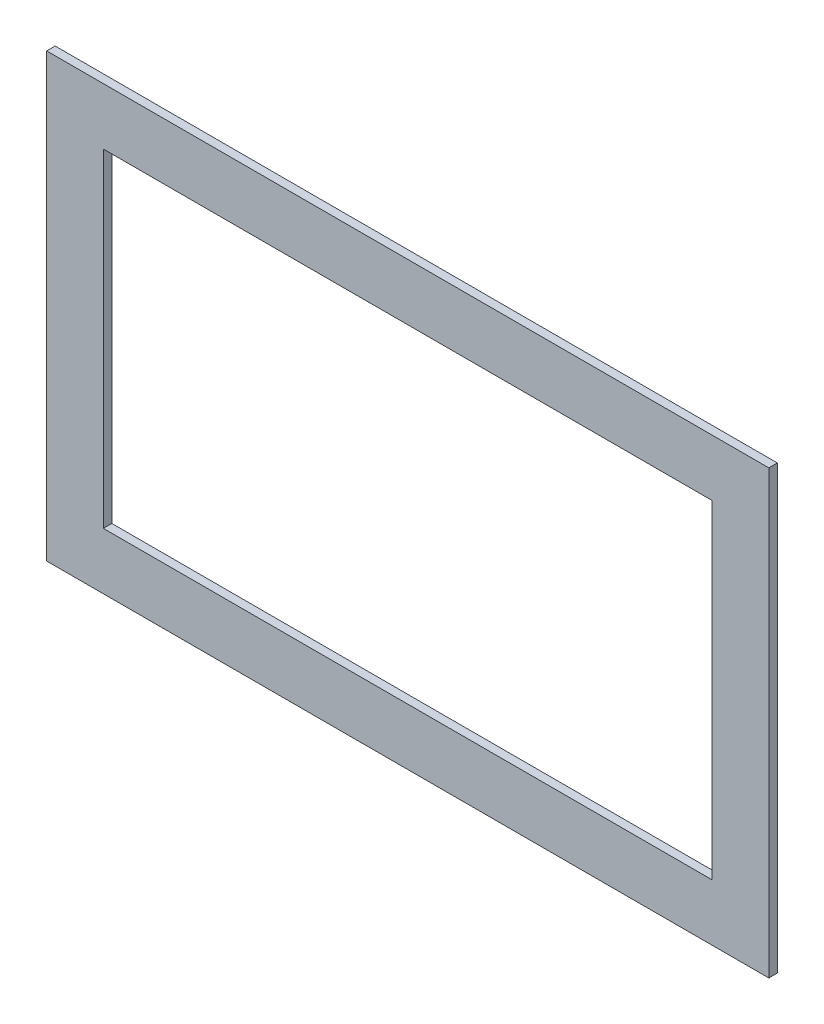
ISO-10303-21;
HEADER;
FILE_DESCRIPTION(('STEP AP214'),'2;1');
FILE_NAME('part.step','',(''),(''),'','','');
FILE_SCHEMA(('AUTOMOTIVE_DESIGN { 1 0 10303 214 1 1 1 1 }'));
ENDSEC;
DATA;
#1=APPLICATION_CONTEXT('core data for automotive mechanical design processes');
#2=APPLICATION_PROTOCOL_DEFINITION('international standard','automotive_design',2000,#1);
#3=PRODUCT_CONTEXT('',#1,'mechanical');
#4=PRODUCT('Part','Part','',(#3));
#5=PRODUCT_RELATED_PRODUCT_CATEGORY('part','',(#4));
#6=PRODUCT_DEFINITION_FORMATION('','',#4);
#7=PRODUCT_DEFINITION_CONTEXT('part definition',#1,'design');
#8=PRODUCT_DEFINITION('design','',#6,#7);
#9=PRODUCT_DEFINITION_SHAPE('','',#8);
#10=(LENGTH_UNIT() NAMED_UNIT(*) SI_UNIT(.MILLI.,.METRE.));
#11=(NAMED_UNIT(*) PLANE_ANGLE_UNIT() SI_UNIT($,.RADIAN.));
#12=(NAMED_UNIT(*) SI_UNIT($,.STERADIAN.) SOLID_ANGLE_UNIT());
#13=UNCERTAINTY_MEASURE_WITH_UNIT(LENGTH_MEASURE(1.E-05),#10,'distance_accuracy_value','');
#14=(GEOMETRIC_REPRESENTATION_CONTEXT(3) GLOBAL_UNCERTAINTY_ASSIGNED_CONTEXT((#13)) GLOBAL_UNIT_ASSIGNED_CONTEXT((#10,
#11,#12)) REPRESENTATION_CONTEXT('',''));
#15=CARTESIAN_POINT('',(0.,0.,0.));
#16=DIRECTION('',(0.,0.,1.));
#17=DIRECTION('',(1.,0.,0.));
#18=AXIS2_PLACEMENT_3D('',#15,#16,#17);
#19=CARTESIAN_POINT('',(0.,0.,21.2898507801741));
#20=DIRECTION('',(0.,0.,-1.));
#21=DIRECTION('',(-1.,0.,0.));
#22=AXIS2_PLACEMENT_3D('',#19,#20,#21);
#23=PLANE('',#22);
#24=DIRECTION('',(0.,-1.,0.));
#25=VECTOR('',#24,1.);
#26=CARTESIAN_POINT('',(9.78246570978144,156.585651873292,21.2898507801741));
#27=LINE('',#26,#25);
#28=CARTESIAN_POINT('',(9.78246570978144,156.585651873292,21.2898507801741));
#29=VERTEX_POINT('',#28);
#30=CARTESIAN_POINT('',(9.78246570978142,0.585651873292431,21.2898507801741));
#31=VERTEX_POINT('',#30);
#32=EDGE_CURVE('E134',#29,#31,#27,.T.);
#33=ORIENTED_EDGE('',*,*,#32,.T.);
#34=DIRECTION('',(-1.,0.,0.));
#35=VECTOR('',#34,1.);
#36=CARTESIAN_POINT('',(9.78246570978142,0.585651873292431,21.2898507801741));
#37=LINE('',#36,#35);
#38=CARTESIAN_POINT('',(-245.217534290219,0.585651873292431,21.2898507801741));
#39=VERTEX_POINT('',#38);
#40=EDGE_CURVE('E137',#31,#39,#37,.T.);
#41=ORIENTED_EDGE('',*,*,#40,.T.);
#42=DIRECTION('',(0.,1.,0.));
#43=VECTOR('',#42,1.);
#44=CARTESIAN_POINT('',(-245.217534290219,156.585651873292,21.2898507801741));
#45=LINE('',#44,#43);
#46=CARTESIAN_POINT('',(-245.217534290219,156.585651873292,21.2898507801741));
#47=VERTEX_POINT('',#46);
#48=EDGE_CURVE('E140',#39,#47,#45,.T.);
#49=ORIENTED_EDGE('',*,*,#48,.T.);
#50=DIRECTION('',(1.,0.,0.));
#51=VECTOR('',#50,1.);
#52=CARTESIAN_POINT('',(9.78246570978144,156.585651873292,21.2898507801741));
#53=LINE('',#52,#51);
#54=EDGE_CURVE('E142',#47,#29,#53,.T.);
#55=ORIENTED_EDGE('',*,*,#54,.T.);
#56=EDGE_LOOP('',(#33,#41,#49,#55));
#57=FACE_BOUND('',#56,.T.);
#58=DIRECTION('',(-1.,0.,0.));
#59=VECTOR('',#58,1.);
#60=CARTESIAN_POINT('',(-10.2175342902186,20.5856518732924,21.2898507801741));
#61=LINE('',#60,#59);
#62=CARTESIAN_POINT('',(-10.2175342902186,20.5856518732924,21.2898507801741));
#63=VERTEX_POINT('',#62);
#64=CARTESIAN_POINT('',(-225.217534290219,20.5856518732924,21.2898507801741));
#65=VERTEX_POINT('',#64);
#66=EDGE_CURVE('E106',#63,#65,#61,.T.);
#67=ORIENTED_EDGE('',*,*,#66,.F.);
#68=DIRECTION('',(0.,-1.,0.));
#69=VECTOR('',#68,1.);
#70=CARTESIAN_POINT('',(-10.2175342902186,136.585651873292,21.2898507801741));
#71=LINE('',#70,#69);
#72=CARTESIAN_POINT('',(-10.2175342902186,136.585651873292,21.2898507801741));
#73=VERTEX_POINT('',#72);
#74=EDGE_CURVE('E98',#73,#63,#71,.T.);
#75=ORIENTED_EDGE('',*,*,#74,.F.);
#76=DIRECTION('',(1.,0.,0.));
#77=VECTOR('',#76,1.);
#78=CARTESIAN_POINT('',(-10.2175342902186,136.585651873292,21.2898507801741));
#79=LINE('',#78,#77);
#80=CARTESIAN_POINT('',(-225.217534290219,136.585651873292,21.2898507801741));
#81=VERTEX_POINT('',#80);
#82=EDGE_CURVE('E120',#81,#73,#79,.T.);
#83=ORIENTED_EDGE('',*,*,#82,.F.);
#84=DIRECTION('',(0.,1.,0.));
#85=VECTOR('',#84,1.);
#86=CARTESIAN_POINT('',(-225.217534290219,136.585651873292,21.2898507801741));
#87=LINE('',#86,#85);
#88=EDGE_CURVE('E118',#65,#81,#87,.T.);
#89=ORIENTED_EDGE('',*,*,#88,.F.);
#90=EDGE_LOOP('',(#67,#75,#83,#89));
#91=FACE_BOUND('',#90,.T.);
#92=ADVANCED_FACE('F33',(#57,#91),#23,.T.);
#93=CARTESIAN_POINT('',(0.,0.,24.2898507801741));
#94=DIRECTION('',(0.,0.,-1.));
#95=DIRECTION('',(-1.,0.,0.));
#96=AXIS2_PLACEMENT_3D('',#93,#94,#95);
#97=PLANE('',#96);
#98=DIRECTION('',(0.,-1.,0.));
#99=VECTOR('',#98,1.);
#100=CARTESIAN_POINT('',(9.78246570978144,156.585651873292,24.2898507801741));
#101=LINE('',#100,#99);
#102=CARTESIAN_POINT('',(9.78246570978144,156.585651873292,24.2898507801741));
#103=VERTEX_POINT('',#102);
#104=CARTESIAN_POINT('',(9.78246570978142,0.585651873292431,24.2898507801741));
#105=VERTEX_POINT('',#104);
#106=EDGE_CURVE('E114',#103,#105,#101,.T.);
#107=ORIENTED_EDGE('',*,*,#106,.F.);
#108=DIRECTION('',(1.,0.,0.));
#109=VECTOR('',#108,1.);
#110=CARTESIAN_POINT('',(9.78246570978144,156.585651873292,24.2898507801741));
#111=LINE('',#110,#109);
#112=CARTESIAN_POINT('',(-245.217534290219,156.585651873292,24.2898507801741));
#113=VERTEX_POINT('',#112);
#114=EDGE_CURVE('E138',#113,#103,#111,.T.);
#115=ORIENTED_EDGE('',*,*,#114,.F.);
#116=DIRECTION('',(0.,1.,0.));
#117=VECTOR('',#116,1.);
#118=CARTESIAN_POINT('',(-245.217534290219,156.585651873292,24.2898507801741));
#119=LINE('',#118,#117);
#120=CARTESIAN_POINT('',(-245.217534290219,0.585651873292431,24.2898507801741));
#121=VERTEX_POINT('',#120);
#122=EDGE_CURVE('E149',#121,#113,#119,.T.);
#123=ORIENTED_EDGE('',*,*,#122,.F.);
#124=DIRECTION('',(-1.,0.,0.));
#125=VECTOR('',#124,1.);
#126=CARTESIAN_POINT('',(9.78246570978142,0.585651873292431,24.2898507801741));
#127=LINE('',#126,#125);
#128=EDGE_CURVE('E147',#105,#121,#127,.T.);
#129=ORIENTED_EDGE('',*,*,#128,.F.);
#130=EDGE_LOOP('',(#107,#115,#123,#129));
#131=FACE_BOUND('',#130,.T.);
#132=DIRECTION('',(0.,-1.,0.));
#133=VECTOR('',#132,1.);
#134=CARTESIAN_POINT('',(-10.2175342902186,136.585651873292,24.2898507801741));
#135=LINE('',#134,#133);
#136=CARTESIAN_POINT('',(-10.2175342902186,136.585651873292,24.2898507801741));
#137=VERTEX_POINT('',#136);
#138=CARTESIAN_POINT('',(-10.2175342902186,20.5856518732924,24.2898507801741));
#139=VERTEX_POINT('',#138);
#140=EDGE_CURVE('E56',#137,#139,#135,.T.);
#141=ORIENTED_EDGE('',*,*,#140,.T.);
#142=DIRECTION('',(-1.,0.,0.));
#143=VECTOR('',#142,1.);
#144=CARTESIAN_POINT('',(-10.2175342902186,20.5856518732924,24.2898507801741));
#145=LINE('',#144,#143);
#146=CARTESIAN_POINT('',(-225.217534290219,20.5856518732924,24.2898507801741));
#147=VERTEX_POINT('',#146);
#148=EDGE_CURVE('E113',#139,#147,#145,.T.);
#149=ORIENTED_EDGE('',*,*,#148,.T.);
#150=DIRECTION('',(0.,1.,0.));
#151=VECTOR('',#150,1.);
#152=CARTESIAN_POINT('',(-225.217534290219,136.585651873292,24.2898507801741));
#153=LINE('',#152,#151);
#154=CARTESIAN_POINT('',(-225.217534290219,136.585651873292,24.2898507801741));
#155=VERTEX_POINT('',#154);
#156=EDGE_CURVE('E126',#147,#155,#153,.T.);
#157=ORIENTED_EDGE('',*,*,#156,.T.);
#158=DIRECTION('',(1.,0.,0.));
#159=VECTOR('',#158,1.);
#160=CARTESIAN_POINT('',(-10.2175342902186,136.585651873292,24.2898507801741));
#161=LINE('',#160,#159);
#162=EDGE_CURVE('E107',#155,#137,#161,.T.);
#163=ORIENTED_EDGE('',*,*,#162,.T.);
#164=EDGE_LOOP('',(#141,#149,#157,#163));
#165=FACE_BOUND('',#164,.T.);
#166=ADVANCED_FACE('F167',(#131,#165),#97,.F.);
#167=CARTESIAN_POINT('',(9.78246570978144,156.585651873292,21.2898507801741));
#168=DIRECTION('',(-1.,0.,0.));
#169=DIRECTION('',(0.,-1.,0.));
#170=AXIS2_PLACEMENT_3D('',#167,#168,#169);
#171=PLANE('',#170);
#172=ORIENTED_EDGE('',*,*,#106,.T.);
#173=DIRECTION('',(0.,0.,1.));
#174=VECTOR('',#173,1.);
#175=CARTESIAN_POINT('',(9.78246570978142,0.585651873292431,21.2898507801741));
#176=LINE('',#175,#174);
#177=EDGE_CURVE('E11',#31,#105,#176,.T.);
#178=ORIENTED_EDGE('',*,*,#177,.F.);
#179=ORIENTED_EDGE('',*,*,#32,.F.);
#180=DIRECTION('',(0.,0.,1.));
#181=VECTOR('',#180,1.);
#182=CARTESIAN_POINT('',(9.78246570978144,156.585651873292,21.2898507801741));
#183=LINE('',#182,#181);
#184=EDGE_CURVE('E144',#29,#103,#183,.T.);
#185=ORIENTED_EDGE('',*,*,#184,.T.);
#186=EDGE_LOOP('',(#172,#178,#179,#185));
#187=FACE_BOUND('',#186,.T.);
#188=ADVANCED_FACE('F35',(#187),#171,.F.);
#189=CARTESIAN_POINT('',(9.78246570978142,0.585651873292431,21.2898507801741));
#190=DIRECTION('',(0.,1.,0.));
#191=DIRECTION('',(0.,0.,1.));
#192=AXIS2_PLACEMENT_3D('',#189,#190,#191);
#193=PLANE('',#192);
#194=ORIENTED_EDGE('',*,*,#128,.T.);
#195=DIRECTION('',(0.,0.,1.));
#196=VECTOR('',#195,1.);
#197=CARTESIAN_POINT('',(-245.217534290219,0.585651873292431,21.2898507801741));
#198=LINE('',#197,#196);
#199=EDGE_CURVE('E41',#39,#121,#198,.T.);
#200=ORIENTED_EDGE('',*,*,#199,.F.);
#201=ORIENTED_EDGE('',*,*,#40,.F.);
#202=ORIENTED_EDGE('',*,*,#177,.T.);
#203=EDGE_LOOP('',(#194,#200,#201,#202));
#204=FACE_BOUND('',#203,.T.);
#205=ADVANCED_FACE('F177',(#204),#193,.F.);
#206=CARTESIAN_POINT('',(-245.217534290219,156.585651873292,21.2898507801741));
#207=DIRECTION('',(1.,0.,0.));
#208=DIRECTION('',(0.,0.,-1.));
#209=AXIS2_PLACEMENT_3D('',#206,#207,#208);
#210=PLANE('',#209);
#211=ORIENTED_EDGE('',*,*,#122,.T.);
#212=DIRECTION('',(0.,0.,1.));
#213=VECTOR('',#212,1.);
#214=CARTESIAN_POINT('',(-245.217534290219,156.585651873292,21.2898507801741));
#215=LINE('',#214,#213);
#216=EDGE_CURVE('E154',#47,#113,#215,.T.);
#217=ORIENTED_EDGE('',*,*,#216,.F.);
#218=ORIENTED_EDGE('',*,*,#48,.F.);
#219=ORIENTED_EDGE('',*,*,#199,.T.);
#220=EDGE_LOOP('',(#211,#217,#218,#219));
#221=FACE_BOUND('',#220,.T.);
#222=ADVANCED_FACE('F161',(#221),#210,.F.);
#223=CARTESIAN_POINT('',(9.78246570978144,156.585651873292,21.2898507801741));
#224=DIRECTION('',(0.,-1.,0.));
#225=DIRECTION('',(0.,0.,-1.));
#226=AXIS2_PLACEMENT_3D('',#223,#224,#225);
#227=PLANE('',#226);
#228=ORIENTED_EDGE('',*,*,#114,.T.);
#229=ORIENTED_EDGE('',*,*,#184,.F.);
#230=ORIENTED_EDGE('',*,*,#54,.F.);
#231=ORIENTED_EDGE('',*,*,#216,.T.);
#232=EDGE_LOOP('',(#228,#229,#230,#231));
#233=FACE_BOUND('',#232,.T.);
#234=ADVANCED_FACE('F171',(#233),#227,.F.);
#235=CARTESIAN_POINT('',(-10.2175342902186,136.585651873292,21.2898507801741));
#236=DIRECTION('',(-1.,0.,0.));
#237=DIRECTION('',(0.,-1.,0.));
#238=AXIS2_PLACEMENT_3D('',#235,#236,#237);
#239=PLANE('',#238);
#240=ORIENTED_EDGE('',*,*,#140,.F.);
#241=DIRECTION('',(0.,0.,1.));
#242=VECTOR('',#241,1.);
#243=CARTESIAN_POINT('',(-10.2175342902186,136.585651873292,21.2898507801741));
#244=LINE('',#243,#242);
#245=EDGE_CURVE('E102',#73,#137,#244,.T.);
#246=ORIENTED_EDGE('',*,*,#245,.F.);
#247=ORIENTED_EDGE('',*,*,#74,.T.);
#248=DIRECTION('',(0.,0.,1.));
#249=VECTOR('',#248,1.);
#250=CARTESIAN_POINT('',(-10.2175342902186,20.5856518732924,21.2898507801741));
#251=LINE('',#250,#249);
#252=EDGE_CURVE('E101',#63,#139,#251,.T.);
#253=ORIENTED_EDGE('',*,*,#252,.T.);
#254=EDGE_LOOP('',(#240,#246,#247,#253));
#255=FACE_BOUND('',#254,.T.);
#256=ADVANCED_FACE('F100',(#255),#239,.T.);
#257=CARTESIAN_POINT('',(-10.2175342902186,20.5856518732924,21.2898507801741));
#258=DIRECTION('',(0.,1.,0.));
#259=DIRECTION('',(0.,0.,1.));
#260=AXIS2_PLACEMENT_3D('',#257,#258,#259);
#261=PLANE('',#260);
#262=ORIENTED_EDGE('',*,*,#148,.F.);
#263=ORIENTED_EDGE('',*,*,#252,.F.);
#264=ORIENTED_EDGE('',*,*,#66,.T.);
#265=DIRECTION('',(0.,0.,1.));
#266=VECTOR('',#265,1.);
#267=CARTESIAN_POINT('',(-225.217534290219,20.5856518732924,21.2898507801741));
#268=LINE('',#267,#266);
#269=EDGE_CURVE('E115',#65,#147,#268,.T.);
#270=ORIENTED_EDGE('',*,*,#269,.T.);
#271=EDGE_LOOP('',(#262,#263,#264,#270));
#272=FACE_BOUND('',#271,.T.);
#273=ADVANCED_FACE('F110',(#272),#261,.T.);
#274=CARTESIAN_POINT('',(-225.217534290219,136.585651873292,21.2898507801741));
#275=DIRECTION('',(1.,0.,0.));
#276=DIRECTION('',(0.,1.,0.));
#277=AXIS2_PLACEMENT_3D('',#274,#275,#276);
#278=PLANE('',#277);
#279=ORIENTED_EDGE('',*,*,#156,.F.);
#280=ORIENTED_EDGE('',*,*,#269,.F.);
#281=ORIENTED_EDGE('',*,*,#88,.T.);
#282=DIRECTION('',(0.,0.,1.));
#283=VECTOR('',#282,1.);
#284=CARTESIAN_POINT('',(-225.217534290219,136.585651873292,21.2898507801741));
#285=LINE('',#284,#283);
#286=EDGE_CURVE('E48',#81,#155,#285,.T.);
#287=ORIENTED_EDGE('',*,*,#286,.T.);
#288=EDGE_LOOP('',(#279,#280,#281,#287));
#289=FACE_BOUND('',#288,.T.);
#290=ADVANCED_FACE('F200',(#289),#278,.T.);
#291=CARTESIAN_POINT('',(-10.2175342902186,136.585651873292,21.2898507801741));
#292=DIRECTION('',(0.,-1.,0.));
#293=DIRECTION('',(0.,0.,-1.));
#294=AXIS2_PLACEMENT_3D('',#291,#292,#293);
#295=PLANE('',#294);
#296=ORIENTED_EDGE('',*,*,#162,.F.);
#297=ORIENTED_EDGE('',*,*,#286,.F.);
#298=ORIENTED_EDGE('',*,*,#82,.T.);
#299=ORIENTED_EDGE('',*,*,#245,.T.);
#300=EDGE_LOOP('',(#296,#297,#298,#299));
#301=FACE_BOUND('',#300,.T.);
#302=ADVANCED_FACE('F204',(#301),#295,.T.);
#303=CLOSED_SHELL('',(#92,#166,#188,#205,#222,#234,#256,#273,#290,#302));
#304=MANIFOLD_SOLID_BREP('B2',#303);
#305=ADVANCED_BREP_SHAPE_REPRESENTATION('',(#18,#304),#14);
#306=SHAPE_DEFINITION_REPRESENTATION(#9,#305);
ENDSEC;
END-ISO-10303-21;
